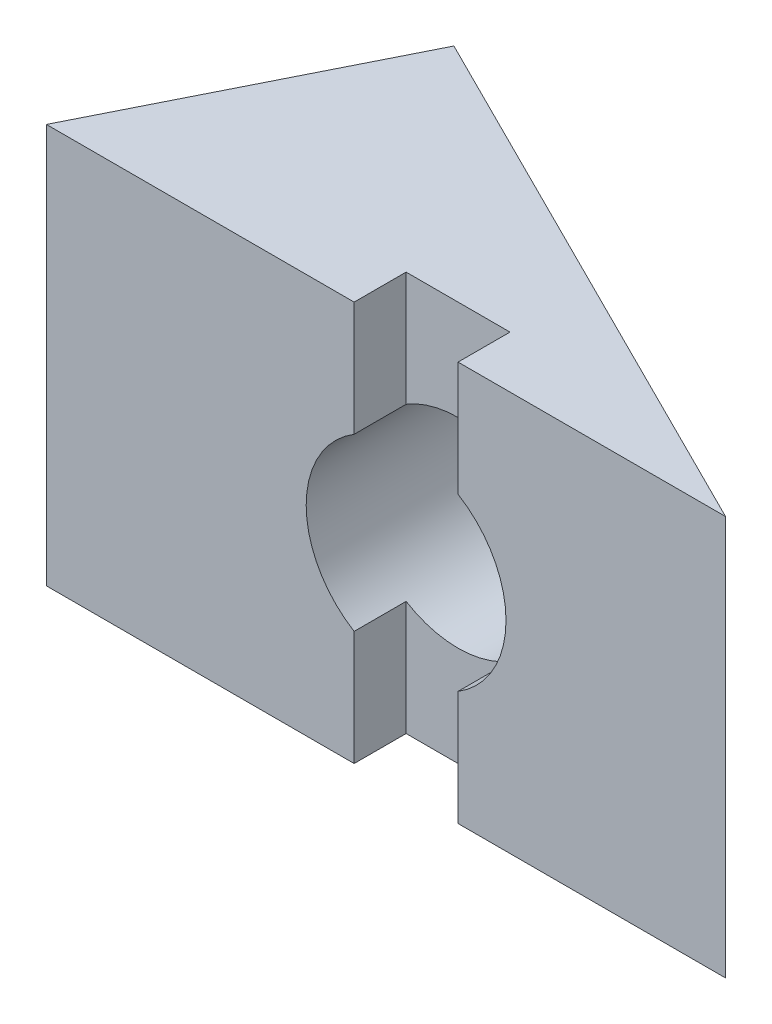
ISO-10303-21;
HEADER;
FILE_DESCRIPTION(('STEP AP214'),'2;1');
FILE_NAME('part.step','',(''),(''),'','','');
FILE_SCHEMA(('AUTOMOTIVE_DESIGN { 1 0 10303 214 1 1 1 1 }'));
ENDSEC;
DATA;
#1=APPLICATION_CONTEXT('core data for automotive mechanical design processes');
#2=APPLICATION_PROTOCOL_DEFINITION('international standard','automotive_design',2000,#1);
#3=PRODUCT_CONTEXT('',#1,'mechanical');
#4=PRODUCT('Part','Part','',(#3));
#5=PRODUCT_RELATED_PRODUCT_CATEGORY('part','',(#4));
#6=PRODUCT_DEFINITION_FORMATION('','',#4);
#7=PRODUCT_DEFINITION_CONTEXT('part definition',#1,'design');
#8=PRODUCT_DEFINITION('design','',#6,#7);
#9=PRODUCT_DEFINITION_SHAPE('','',#8);
#10=(LENGTH_UNIT() NAMED_UNIT(*) SI_UNIT(.MILLI.,.METRE.));
#11=(NAMED_UNIT(*) PLANE_ANGLE_UNIT() SI_UNIT($,.RADIAN.));
#12=(NAMED_UNIT(*) SI_UNIT($,.STERADIAN.) SOLID_ANGLE_UNIT());
#13=UNCERTAINTY_MEASURE_WITH_UNIT(LENGTH_MEASURE(1.E-05),#10,'distance_accuracy_value','');
#14=(GEOMETRIC_REPRESENTATION_CONTEXT(3) GLOBAL_UNCERTAINTY_ASSIGNED_CONTEXT((#13)) GLOBAL_UNIT_ASSIGNED_CONTEXT((#10,
#11,#12)) REPRESENTATION_CONTEXT('',''));
#15=CARTESIAN_POINT('',(0.,0.,0.));
#16=DIRECTION('',(0.,0.,1.));
#17=DIRECTION('',(1.,0.,0.));
#18=AXIS2_PLACEMENT_3D('',#15,#16,#17);
#19=CARTESIAN_POINT('',(-52.4968646446351,100.,55.3915885195369));
#20=DIRECTION('',(0.,0.,-1.));
#21=DIRECTION('',(-1.,0.,0.));
#22=AXIS2_PLACEMENT_3D('',#19,#20,#21);
#23=PLANE('',#22);
#24=DIRECTION('',(0.,-1.,0.));
#25=VECTOR('',#24,1.);
#26=CARTESIAN_POINT('',(50.5031353553649,0.,55.3915885195369));
#27=LINE('',#26,#25);
#28=CARTESIAN_POINT('',(50.5031353553649,100.,55.3915885195369));
#29=VERTEX_POINT('',#28);
#30=CARTESIAN_POINT('',(50.5031353553649,71.3541565040626,55.3915885195369));
#31=VERTEX_POINT('',#30);
#32=EDGE_CURVE('E138',#29,#31,#27,.T.);
#33=ORIENTED_EDGE('',*,*,#32,.T.);
#34=CARTESIAN_POINT('',(37.5031353553649,50.,55.3915885195369));
#35=DIRECTION('',(0.,0.,1.));
#36=DIRECTION('',(1.,0.,0.));
#37=AXIS2_PLACEMENT_3D('',#34,#35,#36);
#38=CIRCLE('',#37,25.);
#39=CARTESIAN_POINT('',(50.5031353553649,28.6458434959374,55.3915885195369));
#40=VERTEX_POINT('',#39);
#41=EDGE_CURVE('E123',#40,#31,#38,.T.);
#42=ORIENTED_EDGE('',*,*,#41,.F.);
#43=DIRECTION('',(0.,-1.,0.));
#44=VECTOR('',#43,1.);
#45=CARTESIAN_POINT('',(50.5031353553649,0.,55.3915885195369));
#46=LINE('',#45,#44);
#47=CARTESIAN_POINT('',(50.5031353553649,0.,55.3915885195369));
#48=VERTEX_POINT('',#47);
#49=EDGE_CURVE('E162',#40,#48,#46,.T.);
#50=ORIENTED_EDGE('',*,*,#49,.T.);
#51=DIRECTION('',(1.,0.,0.));
#52=VECTOR('',#51,1.);
#53=CARTESIAN_POINT('',(-52.4968646446351,0.,55.3915885195369));
#54=LINE('',#53,#52);
#55=CARTESIAN_POINT('',(117.444301645349,0.,55.3915885195369));
#56=VERTEX_POINT('',#55);
#57=EDGE_CURVE('E193',#48,#56,#54,.T.);
#58=ORIENTED_EDGE('',*,*,#57,.T.);
#59=DIRECTION('',(0.,-1.,0.));
#60=VECTOR('',#59,1.);
#61=CARTESIAN_POINT('',(117.444301645349,100.,55.3915885195369));
#62=LINE('',#61,#60);
#63=CARTESIAN_POINT('',(117.444301645349,100.,55.3915885195369));
#64=VERTEX_POINT('',#63);
#65=EDGE_CURVE('E45',#64,#56,#62,.T.);
#66=ORIENTED_EDGE('',*,*,#65,.F.);
#67=DIRECTION('',(1.,0.,0.));
#68=VECTOR('',#67,1.);
#69=CARTESIAN_POINT('',(-52.4968646446351,100.,55.3915885195369));
#70=LINE('',#69,#68);
#71=EDGE_CURVE('E145',#29,#64,#70,.T.);
#72=ORIENTED_EDGE('',*,*,#71,.F.);
#73=EDGE_LOOP('',(#33,#42,#50,#58,#66,#72));
#74=FACE_BOUND('',#73,.T.);
#75=ADVANCED_FACE('F37',(#74),#23,.F.);
#76=DIRECTION('',(0.,-1.,0.));
#77=VECTOR('',#76,1.);
#78=CARTESIAN_POINT('',(24.5031353553649,0.,55.3915885195369));
#79=LINE('',#78,#77);
#80=CARTESIAN_POINT('',(24.5031353553649,28.6458434959374,55.3915885195369));
#81=VERTEX_POINT('',#80);
#82=CARTESIAN_POINT('',(24.5031353553649,0.,55.3915885195369));
#83=VERTEX_POINT('',#82);
#84=EDGE_CURVE('E169',#81,#83,#79,.T.);
#85=ORIENTED_EDGE('',*,*,#84,.F.);
#86=CARTESIAN_POINT('',(24.5031353553649,71.3541565040626,55.3915885195369));
#87=VERTEX_POINT('',#86);
#88=EDGE_CURVE('E134',#87,#81,#38,.T.);
#89=ORIENTED_EDGE('',*,*,#88,.F.);
#90=DIRECTION('',(0.,-1.,0.));
#91=VECTOR('',#90,1.);
#92=CARTESIAN_POINT('',(24.5031353553649,0.,55.3915885195369));
#93=LINE('',#92,#91);
#94=CARTESIAN_POINT('',(24.5031353553649,100.,55.3915885195369));
#95=VERTEX_POINT('',#94);
#96=EDGE_CURVE('E147',#95,#87,#93,.T.);
#97=ORIENTED_EDGE('',*,*,#96,.F.);
#98=CARTESIAN_POINT('',(-52.4968646446351,100.,55.3915885195369));
#99=VERTEX_POINT('',#98);
#100=EDGE_CURVE('E185',#99,#95,#70,.T.);
#101=ORIENTED_EDGE('',*,*,#100,.F.);
#102=DIRECTION('',(0.,-1.,0.));
#103=VECTOR('',#102,1.);
#104=CARTESIAN_POINT('',(-52.4968646446351,100.,55.3915885195369));
#105=LINE('',#104,#103);
#106=CARTESIAN_POINT('',(-52.4968646446351,0.,55.3915885195369));
#107=VERTEX_POINT('',#106);
#108=EDGE_CURVE('E11',#99,#107,#105,.T.);
#109=ORIENTED_EDGE('',*,*,#108,.T.);
#110=EDGE_CURVE('E194',#107,#83,#54,.T.);
#111=ORIENTED_EDGE('',*,*,#110,.T.);
#112=EDGE_LOOP('',(#85,#89,#97,#101,#109,#111));
#113=FACE_BOUND('',#112,.T.);
#114=ADVANCED_FACE('F234',(#113),#23,.F.);
#115=CARTESIAN_POINT('',(0.,100.,0.));
#116=DIRECTION('',(0.,-1.,0.));
#117=DIRECTION('',(0.,0.,-1.));
#118=AXIS2_PLACEMENT_3D('',#115,#116,#117);
#119=PLANE('',#118);
#120=DIRECTION('',(0.,0.,1.));
#121=VECTOR('',#120,1.);
#122=CARTESIAN_POINT('',(50.5031353553649,100.,42.3915885195369));
#123=LINE('',#122,#121);
#124=CARTESIAN_POINT('',(50.5031353553649,100.,42.3915885195369));
#125=VERTEX_POINT('',#124);
#126=EDGE_CURVE('E140',#125,#29,#123,.T.);
#127=ORIENTED_EDGE('',*,*,#126,.T.);
#128=ORIENTED_EDGE('',*,*,#71,.T.);
#129=DIRECTION('',(-0.894427190999916,0.,-0.447213595499959));
#130=VECTOR('',#129,1.);
#131=CARTESIAN_POINT('',(117.444301645349,100.,55.3915885195369));
#132=LINE('',#131,#130);
#133=CARTESIAN_POINT('',(-18.5086313866385,100.,-12.5848779964568));
#134=VERTEX_POINT('',#133);
#135=EDGE_CURVE('E188',#64,#134,#132,.T.);
#136=ORIENTED_EDGE('',*,*,#135,.T.);
#137=DIRECTION('',(-0.447213595499956,0.,0.894427190999917));
#138=VECTOR('',#137,1.);
#139=CARTESIAN_POINT('',(-18.5086313866385,100.,-12.5848779964568));
#140=LINE('',#139,#138);
#141=EDGE_CURVE('E181',#134,#99,#140,.T.);
#142=ORIENTED_EDGE('',*,*,#141,.T.);
#143=ORIENTED_EDGE('',*,*,#100,.T.);
#144=DIRECTION('',(0.,0.,1.));
#145=VECTOR('',#144,1.);
#146=CARTESIAN_POINT('',(24.5031353553649,100.,42.3915885195369));
#147=LINE('',#146,#145);
#148=CARTESIAN_POINT('',(24.5031353553649,100.,42.3915885195369));
#149=VERTEX_POINT('',#148);
#150=EDGE_CURVE('E158',#149,#95,#147,.T.);
#151=ORIENTED_EDGE('',*,*,#150,.F.);
#152=DIRECTION('',(-1.,0.,0.));
#153=VECTOR('',#152,1.);
#154=CARTESIAN_POINT('',(0.,100.,42.3915885195369));
#155=LINE('',#154,#153);
#156=EDGE_CURVE('E146',#125,#149,#155,.T.);
#157=ORIENTED_EDGE('',*,*,#156,.F.);
#158=EDGE_LOOP('',(#127,#128,#136,#142,#143,#151,#157));
#159=FACE_BOUND('',#158,.T.);
#160=ADVANCED_FACE('F214',(#159),#119,.F.);
#161=CARTESIAN_POINT('',(0.,0.,0.));
#162=DIRECTION('',(0.,-1.,0.));
#163=DIRECTION('',(0.,0.,-1.));
#164=AXIS2_PLACEMENT_3D('',#161,#162,#163);
#165=PLANE('',#164);
#166=ORIENTED_EDGE('',*,*,#57,.F.);
#167=DIRECTION('',(0.,0.,1.));
#168=VECTOR('',#167,1.);
#169=CARTESIAN_POINT('',(50.5031353553649,0.,42.3915885195369));
#170=LINE('',#169,#168);
#171=CARTESIAN_POINT('',(50.5031353553649,0.,42.3915885195369));
#172=VERTEX_POINT('',#171);
#173=EDGE_CURVE('E174',#172,#48,#170,.T.);
#174=ORIENTED_EDGE('',*,*,#173,.F.);
#175=DIRECTION('',(1.,0.,0.));
#176=VECTOR('',#175,1.);
#177=CARTESIAN_POINT('',(0.,0.,42.3915885195369));
#178=LINE('',#177,#176);
#179=CARTESIAN_POINT('',(24.5031353553649,0.,42.3915885195369));
#180=VERTEX_POINT('',#179);
#181=EDGE_CURVE('E164',#180,#172,#178,.T.);
#182=ORIENTED_EDGE('',*,*,#181,.F.);
#183=DIRECTION('',(0.,0.,1.));
#184=VECTOR('',#183,1.);
#185=CARTESIAN_POINT('',(24.5031353553649,0.,42.3915885195369));
#186=LINE('',#185,#184);
#187=EDGE_CURVE('E176',#180,#83,#186,.T.);
#188=ORIENTED_EDGE('',*,*,#187,.T.);
#189=ORIENTED_EDGE('',*,*,#110,.F.);
#190=DIRECTION('',(-0.447213595499956,0.,0.894427190999917));
#191=VECTOR('',#190,1.);
#192=CARTESIAN_POINT('',(-18.5086313866385,0.,-12.5848779964568));
#193=LINE('',#192,#191);
#194=CARTESIAN_POINT('',(-18.5086313866385,0.,-12.5848779964568));
#195=VERTEX_POINT('',#194);
#196=EDGE_CURVE('E155',#195,#107,#193,.T.);
#197=ORIENTED_EDGE('',*,*,#196,.F.);
#198=DIRECTION('',(-0.894427190999916,0.,-0.447213595499959));
#199=VECTOR('',#198,1.);
#200=CARTESIAN_POINT('',(117.444301645349,0.,55.3915885195369));
#201=LINE('',#200,#199);
#202=EDGE_CURVE('E184',#56,#195,#201,.T.);
#203=ORIENTED_EDGE('',*,*,#202,.F.);
#204=EDGE_LOOP('',(#166,#174,#182,#188,#189,#197,#203));
#205=FACE_BOUND('',#204,.T.);
#206=ADVANCED_FACE('F208',(#205),#165,.T.);
#207=CARTESIAN_POINT('',(-18.5086313866385,100.,-12.5848779964568));
#208=DIRECTION('',(0.894427190999917,0.,0.447213595499956));
#209=DIRECTION('',(0.447213595499956,0.,-0.894427190999917));
#210=AXIS2_PLACEMENT_3D('',#207,#208,#209);
#211=PLANE('',#210);
#212=ORIENTED_EDGE('',*,*,#196,.T.);
#213=ORIENTED_EDGE('',*,*,#108,.F.);
#214=ORIENTED_EDGE('',*,*,#141,.F.);
#215=DIRECTION('',(0.,-1.,0.));
#216=VECTOR('',#215,1.);
#217=CARTESIAN_POINT('',(-18.5086313866385,100.,-12.5848779964568));
#218=LINE('',#217,#216);
#219=EDGE_CURVE('E190',#134,#195,#218,.T.);
#220=ORIENTED_EDGE('',*,*,#219,.T.);
#221=EDGE_LOOP('',(#212,#213,#214,#220));
#222=FACE_BOUND('',#221,.T.);
#223=ADVANCED_FACE('F39',(#222),#211,.F.);
#224=CARTESIAN_POINT('',(117.444301645349,100.,55.3915885195369));
#225=DIRECTION('',(-0.447213595499959,0.,0.894427190999916));
#226=DIRECTION('',(0.894427190999916,0.,0.447213595499959));
#227=AXIS2_PLACEMENT_3D('',#224,#225,#226);
#228=PLANE('',#227);
#229=CARTESIAN_POINT('',(37.5031353553649,50.,15.4210053745449));
#230=DIRECTION('',(-0.447213595499959,0.,0.894427190999916));
#231=DIRECTION('',(0.894427190999916,0.,0.447213595499959));
#232=AXIS2_PLACEMENT_3D('',#229,#230,#231);
#233=ELLIPSE('',#232,27.9508497187474,25.);
#234=CARTESIAN_POINT('',(62.5031353553649,50.,27.9210053745449));
#235=VERTEX_POINT('',#234);
#236=EDGE_CURVE('E171',#235,#235,#233,.T.);
#237=ORIENTED_EDGE('',*,*,#236,.T.);
#238=EDGE_LOOP('',(#237));
#239=FACE_BOUND('',#238,.T.);
#240=ORIENTED_EDGE('',*,*,#202,.T.);
#241=ORIENTED_EDGE('',*,*,#219,.F.);
#242=ORIENTED_EDGE('',*,*,#135,.F.);
#243=ORIENTED_EDGE('',*,*,#65,.T.);
#244=EDGE_LOOP('',(#240,#241,#242,#243));
#245=FACE_BOUND('',#244,.T.);
#246=ADVANCED_FACE('F203',(#239,#245),#228,.F.);
#247=CARTESIAN_POINT('',(50.5031353553649,0.,42.3915885195369));
#248=DIRECTION('',(-1.,0.,0.));
#249=DIRECTION('',(0.,-1.,0.));
#250=AXIS2_PLACEMENT_3D('',#247,#248,#249);
#251=PLANE('',#250);
#252=ORIENTED_EDGE('',*,*,#49,.F.);
#253=DIRECTION('',(0.,0.,1.));
#254=VECTOR('',#253,1.);
#255=CARTESIAN_POINT('',(50.5031353553649,28.6458434959374,42.3915885195369));
#256=LINE('',#255,#254);
#257=CARTESIAN_POINT('',(50.5031353553649,28.6458434959374,42.3915885195369));
#258=VERTEX_POINT('',#257);
#259=EDGE_CURVE('E129',#258,#40,#256,.T.);
#260=ORIENTED_EDGE('',*,*,#259,.F.);
#261=DIRECTION('',(0.,-1.,0.));
#262=VECTOR('',#261,1.);
#263=CARTESIAN_POINT('',(50.5031353553649,0.,42.3915885195369));
#264=LINE('',#263,#262);
#265=EDGE_CURVE('E166',#258,#172,#264,.T.);
#266=ORIENTED_EDGE('',*,*,#265,.T.);
#267=ORIENTED_EDGE('',*,*,#173,.T.);
#268=EDGE_LOOP('',(#252,#260,#266,#267));
#269=FACE_BOUND('',#268,.T.);
#270=ADVANCED_FACE('F253',(#269),#251,.T.);
#271=CARTESIAN_POINT('',(24.5031353553649,0.,42.3915885195369));
#272=DIRECTION('',(-1.,0.,0.));
#273=DIRECTION('',(0.,-1.,0.));
#274=AXIS2_PLACEMENT_3D('',#271,#272,#273);
#275=PLANE('',#274);
#276=ORIENTED_EDGE('',*,*,#84,.T.);
#277=ORIENTED_EDGE('',*,*,#187,.F.);
#278=DIRECTION('',(0.,-1.,0.));
#279=VECTOR('',#278,1.);
#280=CARTESIAN_POINT('',(24.5031353553649,0.,42.3915885195369));
#281=LINE('',#280,#279);
#282=CARTESIAN_POINT('',(24.5031353553649,28.6458434959374,42.3915885195369));
#283=VERTEX_POINT('',#282);
#284=EDGE_CURVE('E60',#283,#180,#281,.T.);
#285=ORIENTED_EDGE('',*,*,#284,.F.);
#286=DIRECTION('',(0.,0.,1.));
#287=VECTOR('',#286,1.);
#288=CARTESIAN_POINT('',(24.5031353553649,28.6458434959374,42.3915885195369));
#289=LINE('',#288,#287);
#290=EDGE_CURVE('E168',#283,#81,#289,.T.);
#291=ORIENTED_EDGE('',*,*,#290,.T.);
#292=EDGE_LOOP('',(#276,#277,#285,#291));
#293=FACE_BOUND('',#292,.T.);
#294=ADVANCED_FACE('F233',(#293),#275,.F.);
#295=CARTESIAN_POINT('',(0.,0.,42.3915885195369));
#296=DIRECTION('',(0.,0.,1.));
#297=DIRECTION('',(1.,0.,0.));
#298=AXIS2_PLACEMENT_3D('',#295,#296,#297);
#299=PLANE('',#298);
#300=CARTESIAN_POINT('',(37.5031353553649,50.,42.3915885195369));
#301=DIRECTION('',(0.,0.,1.));
#302=DIRECTION('',(1.,0.,0.));
#303=AXIS2_PLACEMENT_3D('',#300,#301,#302);
#304=CIRCLE('',#303,25.);
#305=EDGE_CURVE('E160',#283,#258,#304,.T.);
#306=ORIENTED_EDGE('',*,*,#305,.F.);
#307=ORIENTED_EDGE('',*,*,#284,.T.);
#308=ORIENTED_EDGE('',*,*,#181,.T.);
#309=ORIENTED_EDGE('',*,*,#265,.F.);
#310=EDGE_LOOP('',(#306,#307,#308,#309));
#311=FACE_BOUND('',#310,.T.);
#312=ADVANCED_FACE('F243',(#311),#299,.T.);
#313=CARTESIAN_POINT('',(50.5031353553649,0.,42.3915885195369));
#314=DIRECTION('',(-1.,0.,0.));
#315=DIRECTION('',(0.,-1.,0.));
#316=AXIS2_PLACEMENT_3D('',#313,#314,#315);
#317=PLANE('',#316);
#318=ORIENTED_EDGE('',*,*,#32,.F.);
#319=ORIENTED_EDGE('',*,*,#126,.F.);
#320=DIRECTION('',(0.,-1.,0.));
#321=VECTOR('',#320,1.);
#322=CARTESIAN_POINT('',(50.5031353553649,0.,42.3915885195369));
#323=LINE('',#322,#321);
#324=CARTESIAN_POINT('',(50.5031353553649,71.3541565040626,42.3915885195369));
#325=VERTEX_POINT('',#324);
#326=EDGE_CURVE('E52',#125,#325,#323,.T.);
#327=ORIENTED_EDGE('',*,*,#326,.T.);
#328=DIRECTION('',(0.,0.,1.));
#329=VECTOR('',#328,1.);
#330=CARTESIAN_POINT('',(50.5031353553649,71.3541565040626,42.3915885195369));
#331=LINE('',#330,#329);
#332=EDGE_CURVE('E127',#325,#31,#331,.T.);
#333=ORIENTED_EDGE('',*,*,#332,.T.);
#334=EDGE_LOOP('',(#318,#319,#327,#333));
#335=FACE_BOUND('',#334,.T.);
#336=ADVANCED_FACE('F137',(#335),#317,.T.);
#337=CARTESIAN_POINT('',(24.5031353553649,0.,42.3915885195369));
#338=DIRECTION('',(-1.,0.,0.));
#339=DIRECTION('',(0.,-1.,0.));
#340=AXIS2_PLACEMENT_3D('',#337,#338,#339);
#341=PLANE('',#340);
#342=ORIENTED_EDGE('',*,*,#96,.T.);
#343=DIRECTION('',(0.,0.,1.));
#344=VECTOR('',#343,1.);
#345=CARTESIAN_POINT('',(24.5031353553649,71.3541565040626,42.3915885195369));
#346=LINE('',#345,#344);
#347=CARTESIAN_POINT('',(24.5031353553649,71.3541565040626,42.3915885195369));
#348=VERTEX_POINT('',#347);
#349=EDGE_CURVE('E141',#348,#87,#346,.T.);
#350=ORIENTED_EDGE('',*,*,#349,.F.);
#351=DIRECTION('',(0.,-1.,0.));
#352=VECTOR('',#351,1.);
#353=CARTESIAN_POINT('',(24.5031353553649,0.,42.3915885195369));
#354=LINE('',#353,#352);
#355=EDGE_CURVE('E149',#149,#348,#354,.T.);
#356=ORIENTED_EDGE('',*,*,#355,.F.);
#357=ORIENTED_EDGE('',*,*,#150,.T.);
#358=EDGE_LOOP('',(#342,#350,#356,#357));
#359=FACE_BOUND('',#358,.T.);
#360=ADVANCED_FACE('F235',(#359),#341,.F.);
#361=CARTESIAN_POINT('',(0.,0.,42.3915885195369));
#362=DIRECTION('',(0.,0.,1.));
#363=DIRECTION('',(1.,0.,0.));
#364=AXIS2_PLACEMENT_3D('',#361,#362,#363);
#365=PLANE('',#364);
#366=ORIENTED_EDGE('',*,*,#156,.T.);
#367=ORIENTED_EDGE('',*,*,#355,.T.);
#368=CARTESIAN_POINT('',(37.5031353553649,50.,42.3915885195369));
#369=DIRECTION('',(0.,0.,1.));
#370=DIRECTION('',(1.,0.,0.));
#371=AXIS2_PLACEMENT_3D('',#368,#369,#370);
#372=CIRCLE('',#371,25.);
#373=EDGE_CURVE('E219',#325,#348,#372,.T.);
#374=ORIENTED_EDGE('',*,*,#373,.F.);
#375=ORIENTED_EDGE('',*,*,#326,.F.);
#376=EDGE_LOOP('',(#366,#367,#374,#375));
#377=FACE_BOUND('',#376,.T.);
#378=ADVANCED_FACE('F218',(#377),#365,.T.);
#379=CARTESIAN_POINT('',(37.5031353553649,50.,-12.5848779964568));
#380=DIRECTION('',(0.,0.,1.));
#381=DIRECTION('',(1.,0.,0.));
#382=AXIS2_PLACEMENT_3D('',#379,#380,#381);
#383=CYLINDRICAL_SURFACE('',#382,25.);
#384=ORIENTED_EDGE('',*,*,#259,.T.);
#385=ORIENTED_EDGE('',*,*,#41,.T.);
#386=ORIENTED_EDGE('',*,*,#332,.F.);
#387=ORIENTED_EDGE('',*,*,#373,.T.);
#388=ORIENTED_EDGE('',*,*,#349,.T.);
#389=ORIENTED_EDGE('',*,*,#88,.T.);
#390=ORIENTED_EDGE('',*,*,#290,.F.);
#391=ORIENTED_EDGE('',*,*,#305,.T.);
#392=EDGE_LOOP('',(#384,#385,#386,#387,#388,#389,#390,#391));
#393=FACE_BOUND('',#392,.T.);
#394=ORIENTED_EDGE('',*,*,#236,.F.);
#395=EDGE_LOOP('',(#394));
#396=FACE_BOUND('',#395,.T.);
#397=ADVANCED_FACE('F125',(#393,#396),#383,.F.);
#398=CLOSED_SHELL('',(#75,#114,#160,#206,#223,#246,#270,#294,#312,#336,#360,#378,#397));
#399=MANIFOLD_SOLID_BREP('B2',#398);
#400=ADVANCED_BREP_SHAPE_REPRESENTATION('',(#18,#399),#14);
#401=SHAPE_DEFINITION_REPRESENTATION(#9,#400);
ENDSEC;
END-ISO-10303-21;
